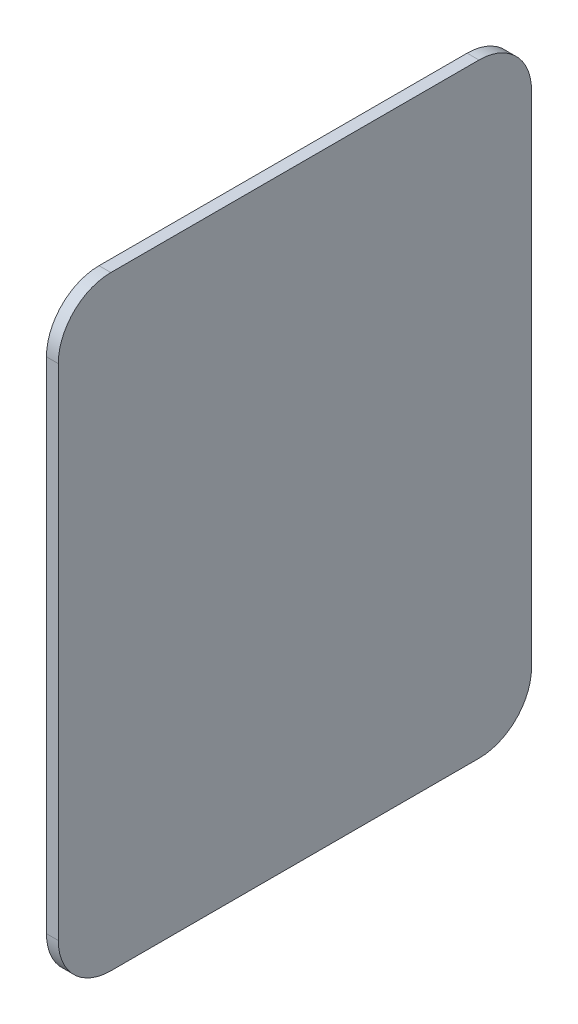
ISO-10303-21;
HEADER;
FILE_DESCRIPTION(('STEP AP214'),'2;1');
FILE_NAME('part.step','',(''),(''),'','','');
FILE_SCHEMA(('AUTOMOTIVE_DESIGN { 1 0 10303 214 1 1 1 1 }'));
ENDSEC;
DATA;
#1=APPLICATION_CONTEXT('core data for automotive mechanical design processes');
#2=APPLICATION_PROTOCOL_DEFINITION('international standard','automotive_design',2000,#1);
#3=PRODUCT_CONTEXT('',#1,'mechanical');
#4=PRODUCT('Part','Part','',(#3));
#5=PRODUCT_RELATED_PRODUCT_CATEGORY('part','',(#4));
#6=PRODUCT_DEFINITION_FORMATION('','',#4);
#7=PRODUCT_DEFINITION_CONTEXT('part definition',#1,'design');
#8=PRODUCT_DEFINITION('design','',#6,#7);
#9=PRODUCT_DEFINITION_SHAPE('','',#8);
#10=(LENGTH_UNIT() NAMED_UNIT(*) SI_UNIT(.MILLI.,.METRE.));
#11=(NAMED_UNIT(*) PLANE_ANGLE_UNIT() SI_UNIT($,.RADIAN.));
#12=(NAMED_UNIT(*) SI_UNIT($,.STERADIAN.) SOLID_ANGLE_UNIT());
#13=UNCERTAINTY_MEASURE_WITH_UNIT(LENGTH_MEASURE(1.E-05),#10,'distance_accuracy_value','');
#14=(GEOMETRIC_REPRESENTATION_CONTEXT(3) GLOBAL_UNCERTAINTY_ASSIGNED_CONTEXT((#13)) GLOBAL_UNIT_ASSIGNED_CONTEXT((#10,
#11,#12)) REPRESENTATION_CONTEXT('',''));
#15=CARTESIAN_POINT('',(0.,0.,0.));
#16=DIRECTION('',(0.,0.,1.));
#17=DIRECTION('',(1.,0.,0.));
#18=AXIS2_PLACEMENT_3D('',#15,#16,#17);
#19=CARTESIAN_POINT('',(4.5,-95.,70.));
#20=DIRECTION('',(-1.,0.,0.));
#21=DIRECTION('',(0.,0.,1.));
#22=AXIS2_PLACEMENT_3D('',#19,#20,#21);
#23=CYLINDRICAL_SURFACE('',#22,20.);
#24=CARTESIAN_POINT('',(0.,-95.,70.));
#25=DIRECTION('',(1.,0.,0.));
#26=DIRECTION('',(0.,0.,1.));
#27=AXIS2_PLACEMENT_3D('',#24,#25,#26);
#28=CIRCLE('',#27,20.);
#29=CARTESIAN_POINT('',(0.,-94.9999999999999,90.));
#30=VERTEX_POINT('',#29);
#31=CARTESIAN_POINT('',(0.,-115.,69.9999999999999));
#32=VERTEX_POINT('',#31);
#33=EDGE_CURVE('E133',#30,#32,#28,.T.);
#34=ORIENTED_EDGE('',*,*,#33,.T.);
#35=DIRECTION('',(-1.,0.,0.));
#36=VECTOR('',#35,1.);
#37=CARTESIAN_POINT('',(4.5,-115.,69.9999999999999));
#38=LINE('',#37,#36);
#39=CARTESIAN_POINT('',(4.5,-115.,69.9999999999999));
#40=VERTEX_POINT('',#39);
#41=EDGE_CURVE('E11',#40,#32,#38,.T.);
#42=ORIENTED_EDGE('',*,*,#41,.F.);
#43=CARTESIAN_POINT('',(4.5,-95.,70.));
#44=DIRECTION('',(1.,0.,0.));
#45=DIRECTION('',(0.,0.,1.));
#46=AXIS2_PLACEMENT_3D('',#43,#44,#45);
#47=CIRCLE('',#46,20.);
#48=CARTESIAN_POINT('',(4.5,-94.9999999999999,90.));
#49=VERTEX_POINT('',#48);
#50=EDGE_CURVE('E147',#49,#40,#47,.T.);
#51=ORIENTED_EDGE('',*,*,#50,.F.);
#52=DIRECTION('',(-1.,0.,0.));
#53=VECTOR('',#52,1.);
#54=CARTESIAN_POINT('',(4.5,-94.9999999999999,90.));
#55=LINE('',#54,#53);
#56=EDGE_CURVE('E129',#49,#30,#55,.T.);
#57=ORIENTED_EDGE('',*,*,#56,.T.);
#58=EDGE_LOOP('',(#34,#42,#51,#57));
#59=FACE_BOUND('',#58,.T.);
#60=ADVANCED_FACE('F37',(#59),#23,.T.);
#61=CARTESIAN_POINT('',(4.5,-115.,-69.9999999999998));
#62=DIRECTION('',(0.,1.,0.));
#63=DIRECTION('',(0.,0.,1.));
#64=AXIS2_PLACEMENT_3D('',#61,#62,#63);
#65=PLANE('',#64);
#66=DIRECTION('',(0.,0.,-1.));
#67=VECTOR('',#66,1.);
#68=CARTESIAN_POINT('',(0.,-115.,-69.9999999999998));
#69=LINE('',#68,#67);
#70=CARTESIAN_POINT('',(0.,-115.,-69.9999999999998));
#71=VERTEX_POINT('',#70);
#72=EDGE_CURVE('E136',#32,#71,#69,.T.);
#73=ORIENTED_EDGE('',*,*,#72,.T.);
#74=DIRECTION('',(-1.,0.,0.));
#75=VECTOR('',#74,1.);
#76=CARTESIAN_POINT('',(4.5,-115.,-69.9999999999998));
#77=LINE('',#76,#75);
#78=CARTESIAN_POINT('',(4.5,-115.,-69.9999999999998));
#79=VERTEX_POINT('',#78);
#80=EDGE_CURVE('E45',#79,#71,#77,.T.);
#81=ORIENTED_EDGE('',*,*,#80,.F.);
#82=DIRECTION('',(0.,0.,-1.));
#83=VECTOR('',#82,1.);
#84=CARTESIAN_POINT('',(4.5,-115.,-69.9999999999998));
#85=LINE('',#84,#83);
#86=EDGE_CURVE('E96',#40,#79,#85,.T.);
#87=ORIENTED_EDGE('',*,*,#86,.F.);
#88=ORIENTED_EDGE('',*,*,#41,.T.);
#89=EDGE_LOOP('',(#73,#81,#87,#88));
#90=FACE_BOUND('',#89,.T.);
#91=ADVANCED_FACE('F182',(#90),#65,.F.);
#92=CARTESIAN_POINT('',(4.5,-95.,-70.));
#93=DIRECTION('',(-1.,0.,0.));
#94=DIRECTION('',(0.,0.,1.));
#95=AXIS2_PLACEMENT_3D('',#92,#93,#94);
#96=CYLINDRICAL_SURFACE('',#95,20.);
#97=CARTESIAN_POINT('',(0.,-95.,-70.));
#98=DIRECTION('',(1.,0.,0.));
#99=DIRECTION('',(0.,0.,-1.));
#100=AXIS2_PLACEMENT_3D('',#97,#98,#99);
#101=CIRCLE('',#100,20.);
#102=CARTESIAN_POINT('',(0.,-95.,-90.));
#103=VERTEX_POINT('',#102);
#104=EDGE_CURVE('E138',#71,#103,#101,.T.);
#105=ORIENTED_EDGE('',*,*,#104,.T.);
#106=DIRECTION('',(-1.,0.,0.));
#107=VECTOR('',#106,1.);
#108=CARTESIAN_POINT('',(4.5,-95.,-90.));
#109=LINE('',#108,#107);
#110=CARTESIAN_POINT('',(4.5,-95.,-90.));
#111=VERTEX_POINT('',#110);
#112=EDGE_CURVE('E154',#111,#103,#109,.T.);
#113=ORIENTED_EDGE('',*,*,#112,.F.);
#114=CARTESIAN_POINT('',(4.5,-95.,-70.));
#115=DIRECTION('',(1.,0.,0.));
#116=DIRECTION('',(0.,0.,-1.));
#117=AXIS2_PLACEMENT_3D('',#114,#115,#116);
#118=CIRCLE('',#117,20.);
#119=EDGE_CURVE('E162',#79,#111,#118,.T.);
#120=ORIENTED_EDGE('',*,*,#119,.F.);
#121=ORIENTED_EDGE('',*,*,#80,.T.);
#122=EDGE_LOOP('',(#105,#113,#120,#121));
#123=FACE_BOUND('',#122,.T.);
#124=ADVANCED_FACE('F160',(#123),#96,.T.);
#125=CARTESIAN_POINT('',(4.5,-94.9999999999999,-90.));
#126=DIRECTION('',(0.,0.,1.));
#127=DIRECTION('',(1.,0.,0.));
#128=AXIS2_PLACEMENT_3D('',#125,#126,#127);
#129=PLANE('',#128);
#130=DIRECTION('',(0.,1.,0.));
#131=VECTOR('',#130,1.);
#132=CARTESIAN_POINT('',(0.,-94.9999999999999,-90.));
#133=LINE('',#132,#131);
#134=CARTESIAN_POINT('',(0.,94.9999999999998,-90.));
#135=VERTEX_POINT('',#134);
#136=EDGE_CURVE('E140',#103,#135,#133,.T.);
#137=ORIENTED_EDGE('',*,*,#136,.T.);
#138=DIRECTION('',(-1.,0.,0.));
#139=VECTOR('',#138,1.);
#140=CARTESIAN_POINT('',(4.5,94.9999999999998,-90.));
#141=LINE('',#140,#139);
#142=CARTESIAN_POINT('',(4.5,94.9999999999998,-90.));
#143=VERTEX_POINT('',#142);
#144=EDGE_CURVE('E151',#143,#135,#141,.T.);
#145=ORIENTED_EDGE('',*,*,#144,.F.);
#146=DIRECTION('',(0.,1.,0.));
#147=VECTOR('',#146,1.);
#148=CARTESIAN_POINT('',(4.5,-94.9999999999999,-90.));
#149=LINE('',#148,#147);
#150=EDGE_CURVE('E174',#111,#143,#149,.T.);
#151=ORIENTED_EDGE('',*,*,#150,.F.);
#152=ORIENTED_EDGE('',*,*,#112,.T.);
#153=EDGE_LOOP('',(#137,#145,#151,#152));
#154=FACE_BOUND('',#153,.T.);
#155=ADVANCED_FACE('F170',(#154),#129,.F.);
#156=CARTESIAN_POINT('',(4.5,95.,-70.));
#157=DIRECTION('',(-1.,0.,0.));
#158=DIRECTION('',(0.,0.,1.));
#159=AXIS2_PLACEMENT_3D('',#156,#157,#158);
#160=CYLINDRICAL_SURFACE('',#159,20.);
#161=CARTESIAN_POINT('',(0.,95.,-70.));
#162=DIRECTION('',(1.,0.,0.));
#163=DIRECTION('',(0.,0.,-1.));
#164=AXIS2_PLACEMENT_3D('',#161,#162,#163);
#165=CIRCLE('',#164,20.);
#166=CARTESIAN_POINT('',(0.,115.,-69.9999999999998));
#167=VERTEX_POINT('',#166);
#168=EDGE_CURVE('E142',#135,#167,#165,.T.);
#169=ORIENTED_EDGE('',*,*,#168,.T.);
#170=DIRECTION('',(-1.,0.,0.));
#171=VECTOR('',#170,1.);
#172=CARTESIAN_POINT('',(4.5,115.,-69.9999999999998));
#173=LINE('',#172,#171);
#174=CARTESIAN_POINT('',(4.5,115.,-69.9999999999998));
#175=VERTEX_POINT('',#174);
#176=EDGE_CURVE('E124',#175,#167,#173,.T.);
#177=ORIENTED_EDGE('',*,*,#176,.F.);
#178=CARTESIAN_POINT('',(4.5,95.,-70.));
#179=DIRECTION('',(1.,0.,0.));
#180=DIRECTION('',(0.,0.,-1.));
#181=AXIS2_PLACEMENT_3D('',#178,#179,#180);
#182=CIRCLE('',#181,20.);
#183=EDGE_CURVE('E115',#143,#175,#182,.T.);
#184=ORIENTED_EDGE('',*,*,#183,.F.);
#185=ORIENTED_EDGE('',*,*,#144,.T.);
#186=EDGE_LOOP('',(#169,#177,#184,#185));
#187=FACE_BOUND('',#186,.T.);
#188=ADVANCED_FACE('F173',(#187),#160,.T.);
#189=CARTESIAN_POINT('',(4.5,115.,-69.9999999999998));
#190=DIRECTION('',(0.,-1.,0.));
#191=DIRECTION('',(0.,0.,-1.));
#192=AXIS2_PLACEMENT_3D('',#189,#190,#191);
#193=PLANE('',#192);
#194=DIRECTION('',(0.,0.,1.));
#195=VECTOR('',#194,1.);
#196=CARTESIAN_POINT('',(0.,115.,-69.9999999999998));
#197=LINE('',#196,#195);
#198=CARTESIAN_POINT('',(0.,115.,69.9999999999999));
#199=VERTEX_POINT('',#198);
#200=EDGE_CURVE('E123',#167,#199,#197,.T.);
#201=ORIENTED_EDGE('',*,*,#200,.T.);
#202=DIRECTION('',(-1.,0.,0.));
#203=VECTOR('',#202,1.);
#204=CARTESIAN_POINT('',(4.5,115.,69.9999999999999));
#205=LINE('',#204,#203);
#206=CARTESIAN_POINT('',(4.5,115.,69.9999999999999));
#207=VERTEX_POINT('',#206);
#208=EDGE_CURVE('E120',#207,#199,#205,.T.);
#209=ORIENTED_EDGE('',*,*,#208,.F.);
#210=DIRECTION('',(0.,0.,1.));
#211=VECTOR('',#210,1.);
#212=CARTESIAN_POINT('',(4.5,115.,-69.9999999999998));
#213=LINE('',#212,#211);
#214=EDGE_CURVE('E109',#175,#207,#213,.T.);
#215=ORIENTED_EDGE('',*,*,#214,.F.);
#216=ORIENTED_EDGE('',*,*,#176,.T.);
#217=EDGE_LOOP('',(#201,#209,#215,#216));
#218=FACE_BOUND('',#217,.T.);
#219=ADVANCED_FACE('F121',(#218),#193,.F.);
#220=CARTESIAN_POINT('',(4.5,94.9999999999999,70.));
#221=DIRECTION('',(-1.,0.,0.));
#222=DIRECTION('',(0.,0.,1.));
#223=AXIS2_PLACEMENT_3D('',#220,#221,#222);
#224=CYLINDRICAL_SURFACE('',#223,20.);
#225=CARTESIAN_POINT('',(0.,94.9999999999999,70.));
#226=DIRECTION('',(1.,0.,0.));
#227=DIRECTION('',(0.,0.,-1.));
#228=AXIS2_PLACEMENT_3D('',#225,#226,#227);
#229=CIRCLE('',#228,20.);
#230=CARTESIAN_POINT('',(0.,94.9999999999998,90.));
#231=VERTEX_POINT('',#230);
#232=EDGE_CURVE('E82',#199,#231,#229,.T.);
#233=ORIENTED_EDGE('',*,*,#232,.T.);
#234=DIRECTION('',(-1.,0.,0.));
#235=VECTOR('',#234,1.);
#236=CARTESIAN_POINT('',(4.5,94.9999999999998,90.));
#237=LINE('',#236,#235);
#238=CARTESIAN_POINT('',(4.5,94.9999999999998,90.));
#239=VERTEX_POINT('',#238);
#240=EDGE_CURVE('E125',#239,#231,#237,.T.);
#241=ORIENTED_EDGE('',*,*,#240,.F.);
#242=CARTESIAN_POINT('',(4.5,94.9999999999999,70.));
#243=DIRECTION('',(1.,0.,0.));
#244=DIRECTION('',(0.,0.,-1.));
#245=AXIS2_PLACEMENT_3D('',#242,#243,#244);
#246=CIRCLE('',#245,20.);
#247=EDGE_CURVE('E113',#207,#239,#246,.T.);
#248=ORIENTED_EDGE('',*,*,#247,.F.);
#249=ORIENTED_EDGE('',*,*,#208,.T.);
#250=EDGE_LOOP('',(#233,#241,#248,#249));
#251=FACE_BOUND('',#250,.T.);
#252=ADVANCED_FACE('F127',(#251),#224,.T.);
#253=CARTESIAN_POINT('',(4.5,-94.9999999999999,90.));
#254=DIRECTION('',(0.,0.,-1.));
#255=DIRECTION('',(-1.,0.,0.));
#256=AXIS2_PLACEMENT_3D('',#253,#254,#255);
#257=PLANE('',#256);
#258=DIRECTION('',(0.,-1.,0.));
#259=VECTOR('',#258,1.);
#260=CARTESIAN_POINT('',(0.,-94.9999999999999,90.));
#261=LINE('',#260,#259);
#262=EDGE_CURVE('E88',#231,#30,#261,.T.);
#263=ORIENTED_EDGE('',*,*,#262,.T.);
#264=ORIENTED_EDGE('',*,*,#56,.F.);
#265=DIRECTION('',(0.,-1.,0.));
#266=VECTOR('',#265,1.);
#267=CARTESIAN_POINT('',(4.5,-94.9999999999999,90.));
#268=LINE('',#267,#266);
#269=EDGE_CURVE('E53',#239,#49,#268,.T.);
#270=ORIENTED_EDGE('',*,*,#269,.F.);
#271=ORIENTED_EDGE('',*,*,#240,.T.);
#272=EDGE_LOOP('',(#263,#264,#270,#271));
#273=FACE_BOUND('',#272,.T.);
#274=ADVANCED_FACE('F198',(#273),#257,.F.);
#275=CARTESIAN_POINT('',(4.5,-95.,70.));
#276=DIRECTION('',(-1.,0.,0.));
#277=DIRECTION('',(0.,0.,1.));
#278=AXIS2_PLACEMENT_3D('',#275,#276,#277);
#279=PLANE('',#278);
#280=ORIENTED_EDGE('',*,*,#50,.T.);
#281=ORIENTED_EDGE('',*,*,#86,.T.);
#282=ORIENTED_EDGE('',*,*,#119,.T.);
#283=ORIENTED_EDGE('',*,*,#150,.T.);
#284=ORIENTED_EDGE('',*,*,#183,.T.);
#285=ORIENTED_EDGE('',*,*,#214,.T.);
#286=ORIENTED_EDGE('',*,*,#247,.T.);
#287=ORIENTED_EDGE('',*,*,#269,.T.);
#288=EDGE_LOOP('',(#280,#281,#282,#283,#284,#285,#286,#287));
#289=FACE_BOUND('',#288,.T.);
#290=ADVANCED_FACE('F111',(#289),#279,.F.);
#291=CARTESIAN_POINT('',(0.,-95.,70.));
#292=DIRECTION('',(-1.,0.,0.));
#293=DIRECTION('',(0.,0.,1.));
#294=AXIS2_PLACEMENT_3D('',#291,#292,#293);
#295=PLANE('',#294);
#296=ORIENTED_EDGE('',*,*,#33,.F.);
#297=ORIENTED_EDGE('',*,*,#262,.F.);
#298=ORIENTED_EDGE('',*,*,#232,.F.);
#299=ORIENTED_EDGE('',*,*,#200,.F.);
#300=ORIENTED_EDGE('',*,*,#168,.F.);
#301=ORIENTED_EDGE('',*,*,#136,.F.);
#302=ORIENTED_EDGE('',*,*,#104,.F.);
#303=ORIENTED_EDGE('',*,*,#72,.F.);
#304=EDGE_LOOP('',(#296,#297,#298,#299,#300,#301,#302,#303));
#305=FACE_BOUND('',#304,.T.);
#306=ADVANCED_FACE('F166',(#305),#295,.T.);
#307=CLOSED_SHELL('',(#60,#91,#124,#155,#188,#219,#252,#274,#290,#306));
#308=MANIFOLD_SOLID_BREP('B2',#307);
#309=ADVANCED_BREP_SHAPE_REPRESENTATION('',(#18,#308),#14);
#310=SHAPE_DEFINITION_REPRESENTATION(#9,#309);
ENDSEC;
END-ISO-10303-21;
